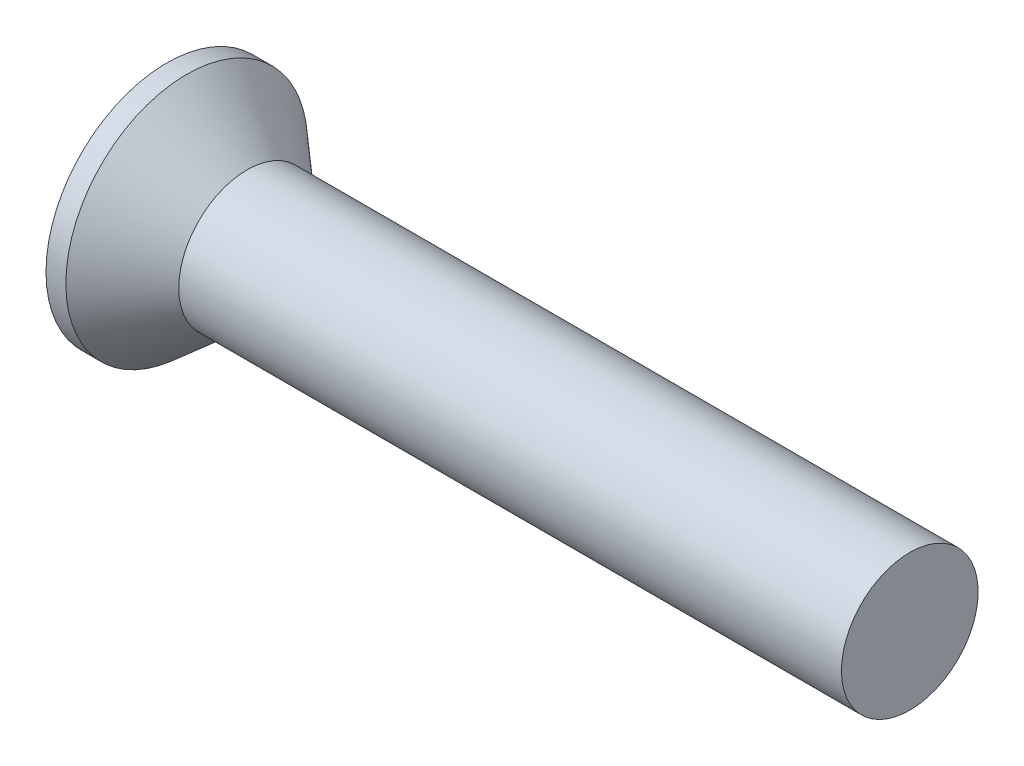
ISO-10303-21;
HEADER;
FILE_DESCRIPTION(('STEP AP214'),'2;1');
FILE_NAME('part.step','',(''),(''),'','','');
FILE_SCHEMA(('AUTOMOTIVE_DESIGN { 1 0 10303 214 1 1 1 1 }'));
ENDSEC;
DATA;
#1=APPLICATION_CONTEXT('core data for automotive mechanical design processes');
#2=APPLICATION_PROTOCOL_DEFINITION('international standard','automotive_design',2000,#1);
#3=PRODUCT_CONTEXT('',#1,'mechanical');
#4=PRODUCT('Part','Part','',(#3));
#5=PRODUCT_RELATED_PRODUCT_CATEGORY('part','',(#4));
#6=PRODUCT_DEFINITION_FORMATION('','',#4);
#7=PRODUCT_DEFINITION_CONTEXT('part definition',#1,'design');
#8=PRODUCT_DEFINITION('design','',#6,#7);
#9=PRODUCT_DEFINITION_SHAPE('','',#8);
#10=(LENGTH_UNIT() NAMED_UNIT(*) SI_UNIT(.MILLI.,.METRE.));
#11=(NAMED_UNIT(*) PLANE_ANGLE_UNIT() SI_UNIT($,.RADIAN.));
#12=(NAMED_UNIT(*) SI_UNIT($,.STERADIAN.) SOLID_ANGLE_UNIT());
#13=UNCERTAINTY_MEASURE_WITH_UNIT(LENGTH_MEASURE(1.E-05),#10,'distance_accuracy_value','');
#14=(GEOMETRIC_REPRESENTATION_CONTEXT(3) GLOBAL_UNCERTAINTY_ASSIGNED_CONTEXT((#13)) GLOBAL_UNIT_ASSIGNED_CONTEXT((#10,
#11,#12)) REPRESENTATION_CONTEXT('',''));
#15=CARTESIAN_POINT('',(0.,0.,0.));
#16=DIRECTION('',(0.,0.,1.));
#17=DIRECTION('',(1.,0.,0.));
#18=AXIS2_PLACEMENT_3D('',#15,#16,#17);
#19=CARTESIAN_POINT('',(0.,0.,0.));
#20=DIRECTION('',(-1.,0.,0.));
#21=DIRECTION('',(0.,0.,1.));
#22=AXIS2_PLACEMENT_3D('',#19,#20,#21);
#23=PLANE('',#22);
#24=CARTESIAN_POINT('',(0.,0.,0.));
#25=DIRECTION('',(-1.,0.,0.));
#26=DIRECTION('',(0.,0.,1.));
#27=AXIS2_PLACEMENT_3D('',#24,#25,#26);
#28=CIRCLE('',#27,3.0988);
#29=CARTESIAN_POINT('',(0.,0.,3.0988));
#30=VERTEX_POINT('',#29);
#31=EDGE_CURVE('E127',#30,#30,#28,.T.);
#32=ORIENTED_EDGE('',*,*,#31,.T.);
#33=EDGE_LOOP('',(#32));
#34=FACE_BOUND('',#33,.T.);
#35=DIRECTION('',(0.,1.,0.));
#36=VECTOR('',#35,1.);
#37=CARTESIAN_POINT('',(0.,-2.4765,-0.4826));
#38=LINE('',#37,#36);
#39=CARTESIAN_POINT('',(0.,-2.4765,-0.4826));
#40=VERTEX_POINT('',#39);
#41=CARTESIAN_POINT('',(0.,-0.482599999999998,-0.4826));
#42=VERTEX_POINT('',#41);
#43=EDGE_CURVE('E102',#40,#42,#38,.T.);
#44=ORIENTED_EDGE('',*,*,#43,.T.);
#45=DIRECTION('',(0.,0.,-1.));
#46=VECTOR('',#45,1.);
#47=CARTESIAN_POINT('',(0.,-0.482600000000008,2.4765));
#48=LINE('',#47,#46);
#49=CARTESIAN_POINT('',(0.,-0.482599999999992,-2.4765));
#50=VERTEX_POINT('',#49);
#51=EDGE_CURVE('E82',#42,#50,#48,.T.);
#52=ORIENTED_EDGE('',*,*,#51,.T.);
#53=DIRECTION('',(0.,1.,0.));
#54=VECTOR('',#53,1.);
#55=CARTESIAN_POINT('',(0.,-0.482599999999992,-2.4765));
#56=LINE('',#55,#54);
#57=CARTESIAN_POINT('',(0.,0.482600000000008,-2.4765));
#58=VERTEX_POINT('',#57);
#59=EDGE_CURVE('E325',#50,#58,#56,.T.);
#60=ORIENTED_EDGE('',*,*,#59,.T.);
#61=DIRECTION('',(0.,0.,1.));
#62=VECTOR('',#61,1.);
#63=CARTESIAN_POINT('',(0.,0.482600000000008,-2.4765));
#64=LINE('',#63,#62);
#65=CARTESIAN_POINT('',(0.,0.482600000000001,-0.4826));
#66=VERTEX_POINT('',#65);
#67=EDGE_CURVE('E98',#58,#66,#64,.T.);
#68=ORIENTED_EDGE('',*,*,#67,.T.);
#69=CARTESIAN_POINT('',(0.,2.4765,-0.4826));
#70=VERTEX_POINT('',#69);
#71=EDGE_CURVE('E92',#66,#70,#38,.T.);
#72=ORIENTED_EDGE('',*,*,#71,.T.);
#73=DIRECTION('',(0.,0.,1.));
#74=VECTOR('',#73,1.);
#75=CARTESIAN_POINT('',(0.,2.4765,-0.4826));
#76=LINE('',#75,#74);
#77=CARTESIAN_POINT('',(0.,2.4765,0.4826));
#78=VERTEX_POINT('',#77);
#79=EDGE_CURVE('E95',#70,#78,#76,.T.);
#80=ORIENTED_EDGE('',*,*,#79,.T.);
#81=DIRECTION('',(0.,-1.,0.));
#82=VECTOR('',#81,1.);
#83=CARTESIAN_POINT('',(0.,2.4765,0.4826));
#84=LINE('',#83,#82);
#85=CARTESIAN_POINT('',(0.,0.482599999999998,0.4826));
#86=VERTEX_POINT('',#85);
#87=EDGE_CURVE('E317',#78,#86,#84,.T.);
#88=ORIENTED_EDGE('',*,*,#87,.T.);
#89=CARTESIAN_POINT('',(0.,0.482599999999991,2.4765));
#90=VERTEX_POINT('',#89);
#91=EDGE_CURVE('E335',#86,#90,#64,.T.);
#92=ORIENTED_EDGE('',*,*,#91,.T.);
#93=DIRECTION('',(0.,-1.,0.));
#94=VECTOR('',#93,1.);
#95=CARTESIAN_POINT('',(0.,0.482599999999991,2.4765));
#96=LINE('',#95,#94);
#97=CARTESIAN_POINT('',(0.,-0.482600000000008,2.4765));
#98=VERTEX_POINT('',#97);
#99=EDGE_CURVE('E337',#90,#98,#96,.T.);
#100=ORIENTED_EDGE('',*,*,#99,.T.);
#101=CARTESIAN_POINT('',(0.,-0.482600000000001,0.4826));
#102=VERTEX_POINT('',#101);
#103=EDGE_CURVE('E339',#98,#102,#48,.T.);
#104=ORIENTED_EDGE('',*,*,#103,.T.);
#105=CARTESIAN_POINT('',(0.,-2.4765,0.4826));
#106=VERTEX_POINT('',#105);
#107=EDGE_CURVE('E108',#102,#106,#84,.T.);
#108=ORIENTED_EDGE('',*,*,#107,.T.);
#109=DIRECTION('',(0.,0.,-1.));
#110=VECTOR('',#109,1.);
#111=CARTESIAN_POINT('',(0.,-2.4765,0.4826));
#112=LINE('',#111,#110);
#113=EDGE_CURVE('E131',#106,#40,#112,.T.);
#114=ORIENTED_EDGE('',*,*,#113,.T.);
#115=EDGE_LOOP('',(#44,#52,#60,#68,#72,#80,#88,#92,#100,#104,#108,#114));
#116=FACE_BOUND('',#115,.T.);
#117=ADVANCED_FACE('F33',(#34,#116),#23,.T.);
#118=CARTESIAN_POINT('',(3.18005113636364,0.,0.215250568181818));
#119=DIRECTION('',(-0.0837752602144701,0.,-0.996484674130013));
#120=DIRECTION('',(-0.996484674130013,0.,0.0837752602144701));
#121=AXIS2_PLACEMENT_3D('',#118,#119,#120);
#122=PLANE('',#121);
#123=ORIENTED_EDGE('',*,*,#107,.F.);
#124=DIRECTION('',(0.993006162058238,0.0834828189340999,-0.0834828189340997));
#125=VECTOR('',#124,1.);
#126=CARTESIAN_POINT('',(3.19789518323365,-0.213750404949385,0.213750404949384));
#127=LINE('',#126,#125);
#128=CARTESIAN_POINT('',(2.8702,-0.241300000000001,0.241299999999999));
#129=VERTEX_POINT('',#128);
#130=EDGE_CURVE('E126',#102,#129,#127,.T.);
#131=ORIENTED_EDGE('',*,*,#130,.T.);
#132=DIRECTION('',(0.78724620786628,0.613076692851616,-0.0661844157055722));
#133=VECTOR('',#132,1.);
#134=CARTESIAN_POINT('',(0.,-2.4765,0.4826));
#135=LINE('',#134,#133);
#136=EDGE_CURVE('E103',#106,#129,#135,.T.);
#137=ORIENTED_EDGE('',*,*,#136,.F.);
#138=EDGE_LOOP('',(#123,#131,#137));
#139=FACE_BOUND('',#138,.T.);
#140=ADVANCED_FACE('F151',(#139),#122,.T.);
#141=DIRECTION('',(0.78724620786628,-0.613076692851616,-0.0661844157055721));
#142=VECTOR('',#141,1.);
#143=CARTESIAN_POINT('',(0.,2.4765,0.4826));
#144=LINE('',#143,#142);
#145=CARTESIAN_POINT('',(2.8702,0.2413,0.2413));
#146=VERTEX_POINT('',#145);
#147=EDGE_CURVE('E48',#78,#146,#144,.T.);
#148=ORIENTED_EDGE('',*,*,#147,.T.);
#149=DIRECTION('',(-0.993006162058239,0.0834828189340993,0.0834828189340996));
#150=VECTOR('',#149,1.);
#151=CARTESIAN_POINT('',(3.19789518323365,0.213750404949383,0.213750404949384));
#152=LINE('',#151,#150);
#153=EDGE_CURVE('E321',#146,#86,#152,.T.);
#154=ORIENTED_EDGE('',*,*,#153,.T.);
#155=ORIENTED_EDGE('',*,*,#87,.F.);
#156=EDGE_LOOP('',(#148,#154,#155));
#157=FACE_BOUND('',#156,.T.);
#158=ADVANCED_FACE('F157',(#157),#122,.T.);
#159=CARTESIAN_POINT('',(3.18005113636364,0.,-0.215250568181818));
#160=DIRECTION('',(-0.08377526021447,0.,0.996484674130013));
#161=DIRECTION('',(0.996484674130013,0.,0.08377526021447));
#162=AXIS2_PLACEMENT_3D('',#159,#160,#161);
#163=PLANE('',#162);
#164=DIRECTION('',(0.78724620786628,0.613076692851616,0.0661844157055721));
#165=VECTOR('',#164,1.);
#166=CARTESIAN_POINT('',(0.,-2.4765,-0.4826));
#167=LINE('',#166,#165);
#168=CARTESIAN_POINT('',(2.8702,-0.241299999999999,-0.241300000000001));
#169=VERTEX_POINT('',#168);
#170=EDGE_CURVE('E57',#40,#169,#167,.T.);
#171=ORIENTED_EDGE('',*,*,#170,.T.);
#172=DIRECTION('',(-0.993006162058239,-0.0834828189340994,-0.0834828189340996));
#173=VECTOR('',#172,1.);
#174=CARTESIAN_POINT('',(3.19789518323364,-0.213750404949383,-0.213750404949384));
#175=LINE('',#174,#173);
#176=EDGE_CURVE('E11',#169,#42,#175,.T.);
#177=ORIENTED_EDGE('',*,*,#176,.T.);
#178=ORIENTED_EDGE('',*,*,#43,.F.);
#179=EDGE_LOOP('',(#171,#177,#178));
#180=FACE_BOUND('',#179,.T.);
#181=ADVANCED_FACE('F148',(#180),#163,.T.);
#182=ORIENTED_EDGE('',*,*,#71,.F.);
#183=DIRECTION('',(0.993006162058238,-0.0834828189340999,0.0834828189340996));
#184=VECTOR('',#183,1.);
#185=CARTESIAN_POINT('',(3.19789518323364,0.213750404949385,-0.213750404949384));
#186=LINE('',#185,#184);
#187=CARTESIAN_POINT('',(2.8702,0.2413,-0.2413));
#188=VERTEX_POINT('',#187);
#189=EDGE_CURVE('E111',#66,#188,#186,.T.);
#190=ORIENTED_EDGE('',*,*,#189,.T.);
#191=DIRECTION('',(0.78724620786628,-0.613076692851616,0.0661844157055721));
#192=VECTOR('',#191,1.);
#193=CARTESIAN_POINT('',(0.,2.4765,-0.4826));
#194=LINE('',#193,#192);
#195=EDGE_CURVE('E107',#70,#188,#194,.T.);
#196=ORIENTED_EDGE('',*,*,#195,.F.);
#197=EDGE_LOOP('',(#182,#190,#196));
#198=FACE_BOUND('',#197,.T.);
#199=ADVANCED_FACE('F110',(#198),#163,.T.);
#200=CARTESIAN_POINT('',(19.05,1.7526,0.));
#201=DIRECTION('',(1.,0.,0.));
#202=DIRECTION('',(0.,0.,-1.));
#203=AXIS2_PLACEMENT_3D('',#200,#201,#202);
#204=PLANE('',#203);
#205=CARTESIAN_POINT('',(19.05,0.,0.));
#206=DIRECTION('',(-1.,0.,0.));
#207=DIRECTION('',(0.,0.,1.));
#208=AXIS2_PLACEMENT_3D('',#205,#206,#207);
#209=CIRCLE('',#208,1.7526);
#210=CARTESIAN_POINT('',(19.05,0.,1.7526));
#211=VERTEX_POINT('',#210);
#212=EDGE_CURVE('E41',#211,#211,#209,.T.);
#213=ORIENTED_EDGE('',*,*,#212,.F.);
#214=EDGE_LOOP('',(#213));
#215=FACE_BOUND('',#214,.T.);
#216=ADVANCED_FACE('F35',(#215),#204,.T.);
#217=CARTESIAN_POINT('',(-6.34999999999999,0.,0.));
#218=DIRECTION('',(-1.,0.,0.));
#219=DIRECTION('',(0.,0.,1.));
#220=AXIS2_PLACEMENT_3D('',#217,#218,#219);
#221=CYLINDRICAL_SURFACE('',#220,1.7526);
#222=ORIENTED_EDGE('',*,*,#212,.T.);
#223=EDGE_LOOP('',(#222));
#224=FACE_BOUND('',#223,.T.);
#225=CARTESIAN_POINT('',(2.0574,0.,0.));
#226=DIRECTION('',(-1.,0.,0.));
#227=DIRECTION('',(0.,0.,1.));
#228=AXIS2_PLACEMENT_3D('',#225,#226,#227);
#229=CIRCLE('',#228,1.7526);
#230=CARTESIAN_POINT('',(2.0574,0.,1.7526));
#231=VERTEX_POINT('',#230);
#232=EDGE_CURVE('E134',#231,#231,#229,.T.);
#233=ORIENTED_EDGE('',*,*,#232,.F.);
#234=EDGE_LOOP('',(#233));
#235=FACE_BOUND('',#234,.T.);
#236=ADVANCED_FACE('F139',(#224,#235),#221,.T.);
#237=CARTESIAN_POINT('',(0.508774050199084,0.,0.));
#238=DIRECTION('',(-1.,0.,0.));
#239=DIRECTION('',(0.,0.,1.));
#240=AXIS2_PLACEMENT_3D('',#237,#238,#239);
#241=CONICAL_SURFACE('',#240,3.0988,0.715584993317677);
#242=ORIENTED_EDGE('',*,*,#232,.T.);
#243=EDGE_LOOP('',(#242));
#244=FACE_BOUND('',#243,.T.);
#245=CARTESIAN_POINT('',(0.508774050199084,0.,0.));
#246=DIRECTION('',(-1.,0.,0.));
#247=DIRECTION('',(0.,0.,1.));
#248=AXIS2_PLACEMENT_3D('',#245,#246,#247);
#249=CIRCLE('',#248,3.0988);
#250=CARTESIAN_POINT('',(0.508774050199084,0.,3.0988));
#251=VERTEX_POINT('',#250);
#252=EDGE_CURVE('E130',#251,#251,#249,.T.);
#253=ORIENTED_EDGE('',*,*,#252,.F.);
#254=EDGE_LOOP('',(#253));
#255=FACE_BOUND('',#254,.T.);
#256=ADVANCED_FACE('F147',(#244,#255),#241,.T.);
#257=CARTESIAN_POINT('',(-6.34999999999999,0.,0.));
#258=DIRECTION('',(-1.,0.,0.));
#259=DIRECTION('',(0.,0.,1.));
#260=AXIS2_PLACEMENT_3D('',#257,#258,#259);
#261=CYLINDRICAL_SURFACE('',#260,3.0988);
#262=ORIENTED_EDGE('',*,*,#252,.T.);
#263=EDGE_LOOP('',(#262));
#264=FACE_BOUND('',#263,.T.);
#265=ORIENTED_EDGE('',*,*,#31,.F.);
#266=EDGE_LOOP('',(#265));
#267=FACE_BOUND('',#266,.T.);
#268=ADVANCED_FACE('F164',(#264,#267),#261,.T.);
#269=CARTESIAN_POINT('',(2.8702,-0.2413,-0.2413));
#270=DIRECTION('',(-1.,0.,0.));
#271=DIRECTION('',(0.,0.,1.));
#272=AXIS2_PLACEMENT_3D('',#269,#270,#271);
#273=PLANE('',#272);
#274=DIRECTION('',(0.,1.,0.));
#275=VECTOR('',#274,1.);
#276=CARTESIAN_POINT('',(2.8702,-0.2413,-0.2413));
#277=LINE('',#276,#275);
#278=EDGE_CURVE('E122',#169,#188,#277,.T.);
#279=ORIENTED_EDGE('',*,*,#278,.F.);
#280=DIRECTION('',(0.,0.,-1.));
#281=VECTOR('',#280,1.);
#282=CARTESIAN_POINT('',(2.8702,-0.2413,0.2413));
#283=LINE('',#282,#281);
#284=EDGE_CURVE('E113',#129,#169,#283,.T.);
#285=ORIENTED_EDGE('',*,*,#284,.F.);
#286=DIRECTION('',(0.,-1.,0.));
#287=VECTOR('',#286,1.);
#288=CARTESIAN_POINT('',(2.8702,0.2413,0.2413));
#289=LINE('',#288,#287);
#290=EDGE_CURVE('E116',#146,#129,#289,.T.);
#291=ORIENTED_EDGE('',*,*,#290,.F.);
#292=DIRECTION('',(0.,0.,1.));
#293=VECTOR('',#292,1.);
#294=CARTESIAN_POINT('',(2.8702,0.2413,-0.2413));
#295=LINE('',#294,#293);
#296=EDGE_CURVE('E120',#188,#146,#295,.T.);
#297=ORIENTED_EDGE('',*,*,#296,.F.);
#298=EDGE_LOOP('',(#279,#285,#291,#297));
#299=FACE_BOUND('',#298,.T.);
#300=ADVANCED_FACE('F162',(#299),#273,.T.);
#301=CARTESIAN_POINT('',(0.,-2.4765,-0.4826));
#302=DIRECTION('',(-0.614423873827266,0.788976110710012,0.));
#303=DIRECTION('',(-0.788976110710012,-0.614423873827266,0.));
#304=AXIS2_PLACEMENT_3D('',#301,#302,#303);
#305=PLANE('',#304);
#306=ORIENTED_EDGE('',*,*,#170,.F.);
#307=ORIENTED_EDGE('',*,*,#113,.F.);
#308=ORIENTED_EDGE('',*,*,#136,.T.);
#309=ORIENTED_EDGE('',*,*,#284,.T.);
#310=EDGE_LOOP('',(#306,#307,#308,#309));
#311=FACE_BOUND('',#310,.T.);
#312=ADVANCED_FACE('F189',(#311),#305,.T.);
#313=CARTESIAN_POINT('',(2.8702,0.2413,0.2413));
#314=DIRECTION('',(-0.614423873827266,-0.788976110710012,0.));
#315=DIRECTION('',(0.788976110710012,-0.614423873827266,0.));
#316=AXIS2_PLACEMENT_3D('',#313,#314,#315);
#317=PLANE('',#316);
#318=ORIENTED_EDGE('',*,*,#147,.F.);
#319=ORIENTED_EDGE('',*,*,#79,.F.);
#320=ORIENTED_EDGE('',*,*,#195,.T.);
#321=ORIENTED_EDGE('',*,*,#296,.T.);
#322=EDGE_LOOP('',(#318,#319,#320,#321));
#323=FACE_BOUND('',#322,.T.);
#324=ADVANCED_FACE('F106',(#323),#317,.T.);
#325=CARTESIAN_POINT('',(3.18005113636364,-0.215250568181818,0.));
#326=DIRECTION('',(-0.0837752602144701,0.996484674130013,0.));
#327=DIRECTION('',(-0.996484674130013,-0.0837752602144701,0.));
#328=AXIS2_PLACEMENT_3D('',#325,#326,#327);
#329=PLANE('',#328);
#330=DIRECTION('',(0.78724620786628,0.0661844157055701,0.613076692851616));
#331=VECTOR('',#330,1.);
#332=CARTESIAN_POINT('',(0.,-0.482599999999992,-2.4765));
#333=LINE('',#332,#331);
#334=EDGE_CURVE('E332',#50,#169,#333,.T.);
#335=ORIENTED_EDGE('',*,*,#334,.F.);
#336=ORIENTED_EDGE('',*,*,#51,.F.);
#337=ORIENTED_EDGE('',*,*,#176,.F.);
#338=EDGE_LOOP('',(#335,#336,#337));
#339=FACE_BOUND('',#338,.T.);
#340=ADVANCED_FACE('F203',(#339),#329,.T.);
#341=CARTESIAN_POINT('',(3.18005113636364,0.215250568181818,0.));
#342=DIRECTION('',(-0.08377526021447,-0.996484674130013,0.));
#343=DIRECTION('',(0.996484674130013,-0.08377526021447,0.));
#344=AXIS2_PLACEMENT_3D('',#341,#342,#343);
#345=PLANE('',#344);
#346=ORIENTED_EDGE('',*,*,#67,.F.);
#347=DIRECTION('',(0.78724620786628,-0.0661844157055743,0.613076692851616));
#348=VECTOR('',#347,1.);
#349=CARTESIAN_POINT('',(0.,0.482600000000008,-2.4765));
#350=LINE('',#349,#348);
#351=EDGE_CURVE('E73',#58,#188,#350,.T.);
#352=ORIENTED_EDGE('',*,*,#351,.T.);
#353=ORIENTED_EDGE('',*,*,#189,.F.);
#354=EDGE_LOOP('',(#346,#352,#353));
#355=FACE_BOUND('',#354,.T.);
#356=ADVANCED_FACE('F209',(#355),#345,.T.);
#357=CARTESIAN_POINT('',(0.,0.482600000000008,-2.4765));
#358=DIRECTION('',(-0.614423873827266,0.,0.788976110710012));
#359=DIRECTION('',(-0.788976110710012,0.,-0.614423873827266));
#360=AXIS2_PLACEMENT_3D('',#357,#358,#359);
#361=PLANE('',#360);
#362=ORIENTED_EDGE('',*,*,#351,.F.);
#363=ORIENTED_EDGE('',*,*,#59,.F.);
#364=ORIENTED_EDGE('',*,*,#334,.T.);
#365=ORIENTED_EDGE('',*,*,#278,.T.);
#366=EDGE_LOOP('',(#362,#363,#364,#365));
#367=FACE_BOUND('',#366,.T.);
#368=ADVANCED_FACE('F217',(#367),#361,.T.);
#369=ORIENTED_EDGE('',*,*,#103,.F.);
#370=DIRECTION('',(0.78724620786628,0.0661844157055742,-0.613076692851616));
#371=VECTOR('',#370,1.);
#372=CARTESIAN_POINT('',(0.,-0.482600000000008,2.4765));
#373=LINE('',#372,#371);
#374=EDGE_CURVE('E328',#98,#129,#373,.T.);
#375=ORIENTED_EDGE('',*,*,#374,.T.);
#376=ORIENTED_EDGE('',*,*,#130,.F.);
#377=EDGE_LOOP('',(#369,#375,#376));
#378=FACE_BOUND('',#377,.T.);
#379=ADVANCED_FACE('F211',(#378),#329,.T.);
#380=DIRECTION('',(0.78724620786628,-0.0661844157055699,-0.613076692851616));
#381=VECTOR('',#380,1.);
#382=CARTESIAN_POINT('',(0.,0.482599999999991,2.4765));
#383=LINE('',#382,#381);
#384=EDGE_CURVE('E326',#90,#146,#383,.T.);
#385=ORIENTED_EDGE('',*,*,#384,.F.);
#386=ORIENTED_EDGE('',*,*,#91,.F.);
#387=ORIENTED_EDGE('',*,*,#153,.F.);
#388=EDGE_LOOP('',(#385,#386,#387));
#389=FACE_BOUND('',#388,.T.);
#390=ADVANCED_FACE('F219',(#389),#345,.T.);
#391=CARTESIAN_POINT('',(2.8702,-0.241300000000001,0.241299999999999));
#392=DIRECTION('',(-0.614423873827266,0.,-0.788976110710012));
#393=DIRECTION('',(0.788976110710012,0.,-0.614423873827266));
#394=AXIS2_PLACEMENT_3D('',#391,#392,#393);
#395=PLANE('',#394);
#396=ORIENTED_EDGE('',*,*,#374,.F.);
#397=ORIENTED_EDGE('',*,*,#99,.F.);
#398=ORIENTED_EDGE('',*,*,#384,.T.);
#399=ORIENTED_EDGE('',*,*,#290,.T.);
#400=EDGE_LOOP('',(#396,#397,#398,#399));
#401=FACE_BOUND('',#400,.T.);
#402=ADVANCED_FACE('F238',(#401),#395,.T.);
#403=CLOSED_SHELL('',(#117,#140,#158,#181,#199,#216,#236,#256,#268,#300,#312,#324,#340,#356,
#368,#379,#390,#402));
#404=MANIFOLD_SOLID_BREP('B2',#403);
#405=ADVANCED_BREP_SHAPE_REPRESENTATION('',(#18,#404),#14);
#406=SHAPE_DEFINITION_REPRESENTATION(#9,#405);
ENDSEC;
END-ISO-10303-21;
